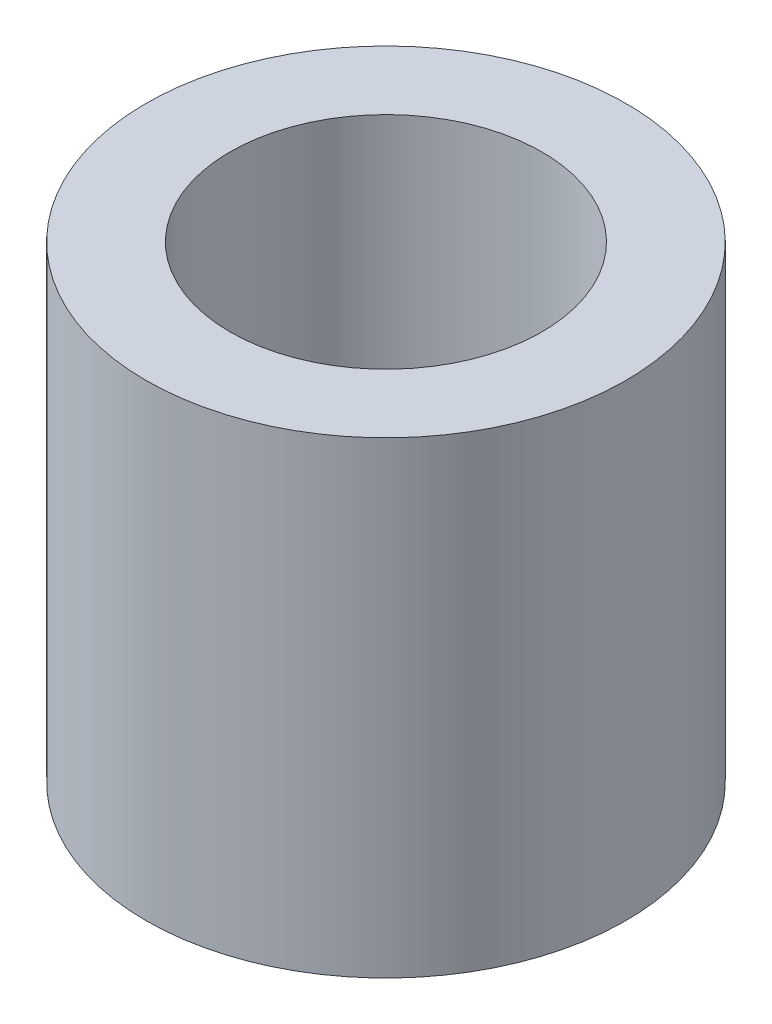
ISO-10303-21;
HEADER;
FILE_DESCRIPTION(('STEP AP214'),'2;1');
FILE_NAME('part.step','',(''),(''),'','','');
FILE_SCHEMA(('AUTOMOTIVE_DESIGN { 1 0 10303 214 1 1 1 1 }'));
ENDSEC;
DATA;
#1=APPLICATION_CONTEXT('core data for automotive mechanical design processes');
#2=APPLICATION_PROTOCOL_DEFINITION('international standard','automotive_design',2000,#1);
#3=PRODUCT_CONTEXT('',#1,'mechanical');
#4=PRODUCT('Part','Part','',(#3));
#5=PRODUCT_RELATED_PRODUCT_CATEGORY('part','',(#4));
#6=PRODUCT_DEFINITION_FORMATION('','',#4);
#7=PRODUCT_DEFINITION_CONTEXT('part definition',#1,'design');
#8=PRODUCT_DEFINITION('design','',#6,#7);
#9=PRODUCT_DEFINITION_SHAPE('','',#8);
#10=(LENGTH_UNIT() NAMED_UNIT(*) SI_UNIT(.MILLI.,.METRE.));
#11=(NAMED_UNIT(*) PLANE_ANGLE_UNIT() SI_UNIT($,.RADIAN.));
#12=(NAMED_UNIT(*) SI_UNIT($,.STERADIAN.) SOLID_ANGLE_UNIT());
#13=UNCERTAINTY_MEASURE_WITH_UNIT(LENGTH_MEASURE(1.E-05),#10,'distance_accuracy_value','');
#14=(GEOMETRIC_REPRESENTATION_CONTEXT(3) GLOBAL_UNCERTAINTY_ASSIGNED_CONTEXT((#13)) GLOBAL_UNIT_ASSIGNED_CONTEXT((#10,
#11,#12)) REPRESENTATION_CONTEXT('',''));
#15=CARTESIAN_POINT('',(0.,0.,0.));
#16=DIRECTION('',(0.,0.,1.));
#17=DIRECTION('',(1.,0.,0.));
#18=AXIS2_PLACEMENT_3D('',#15,#16,#17);
#19=CARTESIAN_POINT('',(0.,7.8,0.));
#20=DIRECTION('',(0.,1.,0.));
#21=DIRECTION('',(0.,0.,1.));
#22=AXIS2_PLACEMENT_3D('',#19,#20,#21);
#23=PLANE('',#22);
#24=CARTESIAN_POINT('',(0.,7.8,0.));
#25=DIRECTION('',(0.,1.,0.));
#26=DIRECTION('',(0.,0.,1.));
#27=AXIS2_PLACEMENT_3D('',#24,#25,#26);
#28=CIRCLE('',#27,4.);
#29=CARTESIAN_POINT('',(0.,7.8,4.));
#30=VERTEX_POINT('',#29);
#31=EDGE_CURVE('E10',#30,#30,#28,.T.);
#32=ORIENTED_EDGE('',*,*,#31,.T.);
#33=EDGE_LOOP('',(#32));
#34=FACE_BOUND('',#33,.T.);
#35=CARTESIAN_POINT('',(0.,7.8,0.));
#36=DIRECTION('',(0.,1.,0.));
#37=DIRECTION('',(0.,0.,1.));
#38=AXIS2_PLACEMENT_3D('',#35,#36,#37);
#39=CIRCLE('',#38,2.6);
#40=CARTESIAN_POINT('',(0.,7.8,2.6));
#41=VERTEX_POINT('',#40);
#42=EDGE_CURVE('E41',#41,#41,#39,.T.);
#43=ORIENTED_EDGE('',*,*,#42,.F.);
#44=EDGE_LOOP('',(#43));
#45=FACE_BOUND('',#44,.T.);
#46=ADVANCED_FACE('F30',(#34,#45),#23,.T.);
#47=CARTESIAN_POINT('',(0.,0.,0.));
#48=DIRECTION('',(0.,1.,0.));
#49=DIRECTION('',(0.,0.,1.));
#50=AXIS2_PLACEMENT_3D('',#47,#48,#49);
#51=PLANE('',#50);
#52=CARTESIAN_POINT('',(0.,0.,0.));
#53=DIRECTION('',(0.,1.,0.));
#54=DIRECTION('',(0.,0.,1.));
#55=AXIS2_PLACEMENT_3D('',#52,#53,#54);
#56=CIRCLE('',#55,4.);
#57=CARTESIAN_POINT('',(0.,0.,4.));
#58=VERTEX_POINT('',#57);
#59=EDGE_CURVE('E34',#58,#58,#56,.T.);
#60=ORIENTED_EDGE('',*,*,#59,.F.);
#61=EDGE_LOOP('',(#60));
#62=FACE_BOUND('',#61,.T.);
#63=CARTESIAN_POINT('',(0.,0.,0.));
#64=DIRECTION('',(0.,1.,0.));
#65=DIRECTION('',(0.,0.,1.));
#66=AXIS2_PLACEMENT_3D('',#63,#64,#65);
#67=CIRCLE('',#66,2.6);
#68=CARTESIAN_POINT('',(0.,0.,2.6));
#69=VERTEX_POINT('',#68);
#70=EDGE_CURVE('E43',#69,#69,#67,.T.);
#71=ORIENTED_EDGE('',*,*,#70,.T.);
#72=EDGE_LOOP('',(#71));
#73=FACE_BOUND('',#72,.T.);
#74=ADVANCED_FACE('F53',(#62,#73),#51,.F.);
#75=CARTESIAN_POINT('',(0.,7.8,0.));
#76=DIRECTION('',(0.,-1.,0.));
#77=DIRECTION('',(0.,0.,-1.));
#78=AXIS2_PLACEMENT_3D('',#75,#76,#77);
#79=CYLINDRICAL_SURFACE('',#78,4.);
#80=ORIENTED_EDGE('',*,*,#31,.F.);
#81=EDGE_LOOP('',(#80));
#82=FACE_BOUND('',#81,.T.);
#83=ORIENTED_EDGE('',*,*,#59,.T.);
#84=EDGE_LOOP('',(#83));
#85=FACE_BOUND('',#84,.T.);
#86=ADVANCED_FACE('F32',(#82,#85),#79,.T.);
#87=CARTESIAN_POINT('',(0.,7.8,0.));
#88=DIRECTION('',(0.,-1.,0.));
#89=DIRECTION('',(0.,0.,-1.));
#90=AXIS2_PLACEMENT_3D('',#87,#88,#89);
#91=CYLINDRICAL_SURFACE('',#90,2.6);
#92=ORIENTED_EDGE('',*,*,#42,.T.);
#93=EDGE_LOOP('',(#92));
#94=FACE_BOUND('',#93,.T.);
#95=ORIENTED_EDGE('',*,*,#70,.F.);
#96=EDGE_LOOP('',(#95));
#97=FACE_BOUND('',#96,.T.);
#98=ADVANCED_FACE('F49',(#94,#97),#91,.F.);
#99=CLOSED_SHELL('',(#46,#74,#86,#98));
#100=MANIFOLD_SOLID_BREP('B2',#99);
#101=ADVANCED_BREP_SHAPE_REPRESENTATION('',(#18,#100),#14);
#102=SHAPE_DEFINITION_REPRESENTATION(#9,#101);
ENDSEC;
END-ISO-10303-21;
